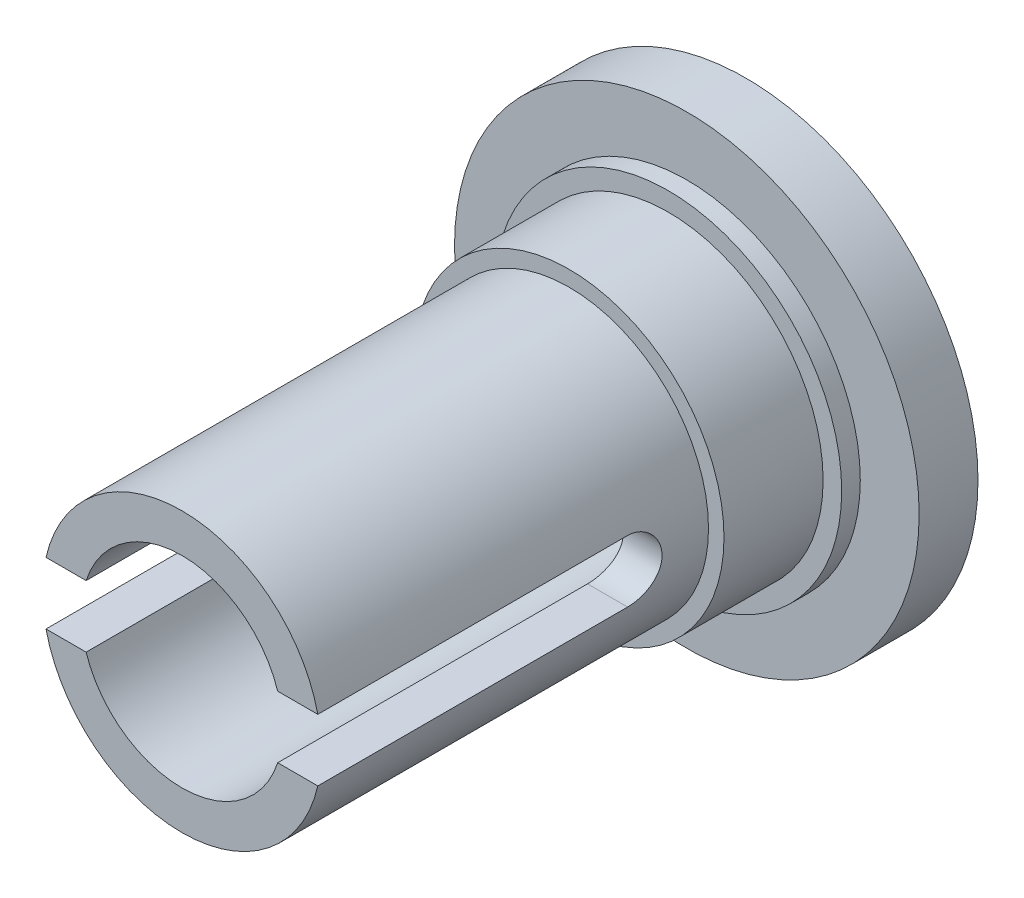
ISO-10303-21;
HEADER;
FILE_DESCRIPTION(('STEP AP214'),'2;1');
FILE_NAME('part.step','',(''),(''),'','','');
FILE_SCHEMA(('AUTOMOTIVE_DESIGN { 1 0 10303 214 1 1 1 1 }'));
ENDSEC;
DATA;
#1=APPLICATION_CONTEXT('core data for automotive mechanical design processes');
#2=APPLICATION_PROTOCOL_DEFINITION('international standard','automotive_design',2000,#1);
#3=PRODUCT_CONTEXT('',#1,'mechanical');
#4=PRODUCT('Part','Part','',(#3));
#5=PRODUCT_RELATED_PRODUCT_CATEGORY('part','',(#4));
#6=PRODUCT_DEFINITION_FORMATION('','',#4);
#7=PRODUCT_DEFINITION_CONTEXT('part definition',#1,'design');
#8=PRODUCT_DEFINITION('design','',#6,#7);
#9=PRODUCT_DEFINITION_SHAPE('','',#8);
#10=(LENGTH_UNIT() NAMED_UNIT(*) SI_UNIT(.MILLI.,.METRE.));
#11=(NAMED_UNIT(*) PLANE_ANGLE_UNIT() SI_UNIT($,.RADIAN.));
#12=(NAMED_UNIT(*) SI_UNIT($,.STERADIAN.) SOLID_ANGLE_UNIT());
#13=UNCERTAINTY_MEASURE_WITH_UNIT(LENGTH_MEASURE(1.E-05),#10,'distance_accuracy_value','');
#14=(GEOMETRIC_REPRESENTATION_CONTEXT(3) GLOBAL_UNCERTAINTY_ASSIGNED_CONTEXT((#13)) GLOBAL_UNIT_ASSIGNED_CONTEXT((#10,
#11,#12)) REPRESENTATION_CONTEXT('',''));
#15=CARTESIAN_POINT('',(0.,0.,0.));
#16=DIRECTION('',(0.,0.,1.));
#17=DIRECTION('',(1.,0.,0.));
#18=AXIS2_PLACEMENT_3D('',#15,#16,#17);
#19=CARTESIAN_POINT('',(0.,0.,3.175));
#20=DIRECTION('',(0.,0.,1.));
#21=DIRECTION('',(1.,0.,0.));
#22=AXIS2_PLACEMENT_3D('',#19,#20,#21);
#23=PLANE('',#22);
#24=CARTESIAN_POINT('',(0.,0.,3.175));
#25=DIRECTION('',(0.,0.,1.));
#26=DIRECTION('',(1.,0.,0.));
#27=AXIS2_PLACEMENT_3D('',#24,#25,#26);
#28=CIRCLE('',#27,6.35);
#29=CARTESIAN_POINT('',(6.35,0.,3.175));
#30=VERTEX_POINT('',#29);
#31=EDGE_CURVE('E142',#30,#30,#28,.T.);
#32=ORIENTED_EDGE('',*,*,#31,.F.);
#33=EDGE_LOOP('',(#32));
#34=FACE_BOUND('',#33,.T.);
#35=CARTESIAN_POINT('',(0.,0.,3.175));
#36=DIRECTION('',(0.,0.,1.));
#37=DIRECTION('',(1.,0.,0.));
#38=AXIS2_PLACEMENT_3D('',#35,#36,#37);
#39=CIRCLE('',#38,7.112);
#40=CARTESIAN_POINT('',(7.112,0.,3.175));
#41=VERTEX_POINT('',#40);
#42=EDGE_CURVE('E226',#41,#41,#39,.T.);
#43=ORIENTED_EDGE('',*,*,#42,.T.);
#44=EDGE_LOOP('',(#43));
#45=FACE_BOUND('',#44,.T.);
#46=ADVANCED_FACE('F35',(#34,#45),#23,.T.);
#47=CARTESIAN_POINT('',(0.,0.,3.175));
#48=DIRECTION('',(0.,0.,-1.));
#49=DIRECTION('',(-1.,0.,0.));
#50=AXIS2_PLACEMENT_3D('',#47,#48,#49);
#51=CYLINDRICAL_SURFACE('',#50,9.525);
#52=CARTESIAN_POINT('',(0.,0.,0.));
#53=DIRECTION('',(0.,0.,1.));
#54=DIRECTION('',(1.,0.,0.));
#55=AXIS2_PLACEMENT_3D('',#52,#53,#54);
#56=CIRCLE('',#55,9.525);
#57=CARTESIAN_POINT('',(9.525,0.,0.));
#58=VERTEX_POINT('',#57);
#59=EDGE_CURVE('E148',#58,#58,#56,.T.);
#60=ORIENTED_EDGE('',*,*,#59,.T.);
#61=EDGE_LOOP('',(#60));
#62=FACE_BOUND('',#61,.T.);
#63=CARTESIAN_POINT('',(0.,0.,2.413));
#64=DIRECTION('',(0.,0.,1.));
#65=DIRECTION('',(1.,0.,0.));
#66=AXIS2_PLACEMENT_3D('',#63,#64,#65);
#67=CIRCLE('',#66,9.525);
#68=CARTESIAN_POINT('',(9.525,0.,2.413));
#69=VERTEX_POINT('',#68);
#70=EDGE_CURVE('E220',#69,#69,#67,.T.);
#71=ORIENTED_EDGE('',*,*,#70,.F.);
#72=EDGE_LOOP('',(#71));
#73=FACE_BOUND('',#72,.T.);
#74=ADVANCED_FACE('F37',(#62,#73),#51,.T.);
#75=CARTESIAN_POINT('',(0.,0.,23.114));
#76=DIRECTION('',(0.,0.,1.));
#77=DIRECTION('',(1.,0.,0.));
#78=AXIS2_PLACEMENT_3D('',#75,#76,#77);
#79=PLANE('',#78);
#80=CARTESIAN_POINT('',(0.,0.,23.114));
#81=DIRECTION('',(0.,0.,1.));
#82=DIRECTION('',(1.,0.,0.));
#83=AXIS2_PLACEMENT_3D('',#80,#81,#82);
#84=CIRCLE('',#83,5.715);
#85=CARTESIAN_POINT('',(5.57210238599399,1.27,23.114));
#86=VERTEX_POINT('',#85);
#87=CARTESIAN_POINT('',(-5.572102385994,1.27,23.114));
#88=VERTEX_POINT('',#87);
#89=EDGE_CURVE('E139',#86,#88,#84,.T.);
#90=ORIENTED_EDGE('',*,*,#89,.T.);
#91=DIRECTION('',(1.,0.,0.));
#92=VECTOR('',#91,1.);
#93=CARTESIAN_POINT('',(-9.525,1.27,23.114));
#94=LINE('',#93,#92);
#95=CARTESIAN_POINT('',(-3.92725810840082,1.27,23.114));
#96=VERTEX_POINT('',#95);
#97=EDGE_CURVE('E232',#88,#96,#94,.T.);
#98=ORIENTED_EDGE('',*,*,#97,.T.);
#99=CARTESIAN_POINT('',(0.,0.,23.114));
#100=DIRECTION('',(0.,0.,1.));
#101=DIRECTION('',(1.,0.,0.));
#102=AXIS2_PLACEMENT_3D('',#99,#100,#101);
#103=CIRCLE('',#102,4.1275);
#104=CARTESIAN_POINT('',(3.92725810840082,1.27,23.114));
#105=VERTEX_POINT('',#104);
#106=EDGE_CURVE('E128',#105,#96,#103,.T.);
#107=ORIENTED_EDGE('',*,*,#106,.F.);
#108=EDGE_CURVE('E233',#105,#86,#94,.T.);
#109=ORIENTED_EDGE('',*,*,#108,.T.);
#110=EDGE_LOOP('',(#90,#98,#107,#109));
#111=FACE_BOUND('',#110,.T.);
#112=ADVANCED_FACE('F201',(#111),#79,.T.);
#113=CARTESIAN_POINT('',(0.,0.,7.239));
#114=DIRECTION('',(0.,0.,1.));
#115=DIRECTION('',(1.,0.,0.));
#116=AXIS2_PLACEMENT_3D('',#113,#114,#115);
#117=PLANE('',#116);
#118=CARTESIAN_POINT('',(0.,0.,7.239));
#119=DIRECTION('',(0.,0.,1.));
#120=DIRECTION('',(1.,0.,0.));
#121=AXIS2_PLACEMENT_3D('',#118,#119,#120);
#122=CIRCLE('',#121,6.35);
#123=CARTESIAN_POINT('',(6.35,0.,7.239));
#124=VERTEX_POINT('',#123);
#125=EDGE_CURVE('E145',#124,#124,#122,.T.);
#126=ORIENTED_EDGE('',*,*,#125,.T.);
#127=EDGE_LOOP('',(#126));
#128=FACE_BOUND('',#127,.T.);
#129=CARTESIAN_POINT('',(0.,0.,7.239));
#130=DIRECTION('',(0.,0.,1.));
#131=DIRECTION('',(1.,0.,0.));
#132=AXIS2_PLACEMENT_3D('',#129,#130,#131);
#133=CIRCLE('',#132,5.715);
#134=CARTESIAN_POINT('',(5.715,0.,7.239));
#135=VERTEX_POINT('',#134);
#136=EDGE_CURVE('E136',#135,#135,#133,.T.);
#137=ORIENTED_EDGE('',*,*,#136,.F.);
#138=EDGE_LOOP('',(#137));
#139=FACE_BOUND('',#138,.T.);
#140=ADVANCED_FACE('F196',(#128,#139),#117,.T.);
#141=CARTESIAN_POINT('',(0.,0.,0.));
#142=DIRECTION('',(0.,0.,1.));
#143=DIRECTION('',(1.,0.,0.));
#144=AXIS2_PLACEMENT_3D('',#141,#142,#143);
#145=PLANE('',#144);
#146=CARTESIAN_POINT('',(0.,0.,0.));
#147=DIRECTION('',(0.,0.,1.));
#148=DIRECTION('',(1.,0.,0.));
#149=AXIS2_PLACEMENT_3D('',#146,#147,#148);
#150=CIRCLE('',#149,4.1275);
#151=CARTESIAN_POINT('',(4.1275,0.,0.));
#152=VERTEX_POINT('',#151);
#153=EDGE_CURVE('E134',#152,#152,#150,.T.);
#154=ORIENTED_EDGE('',*,*,#153,.T.);
#155=EDGE_LOOP('',(#154));
#156=FACE_BOUND('',#155,.T.);
#157=ORIENTED_EDGE('',*,*,#59,.F.);
#158=EDGE_LOOP('',(#157));
#159=FACE_BOUND('',#158,.T.);
#160=ADVANCED_FACE('F200',(#156,#159),#145,.F.);
#161=CARTESIAN_POINT('',(0.,0.,7.239));
#162=DIRECTION('',(0.,0.,-1.));
#163=DIRECTION('',(-1.,0.,0.));
#164=AXIS2_PLACEMENT_3D('',#161,#162,#163);
#165=CYLINDRICAL_SURFACE('',#164,6.35);
#166=ORIENTED_EDGE('',*,*,#125,.F.);
#167=EDGE_LOOP('',(#166));
#168=FACE_BOUND('',#167,.T.);
#169=ORIENTED_EDGE('',*,*,#31,.T.);
#170=EDGE_LOOP('',(#169));
#171=FACE_BOUND('',#170,.T.);
#172=ADVANCED_FACE('F195',(#168,#171),#165,.T.);
#173=CARTESIAN_POINT('',(0.,0.,23.114));
#174=DIRECTION('',(0.,0.,-1.));
#175=DIRECTION('',(-1.,0.,0.));
#176=AXIS2_PLACEMENT_3D('',#173,#174,#175);
#177=CYLINDRICAL_SURFACE('',#176,5.715);
#178=CARTESIAN_POINT('',(-5.572102385994,-1.27,23.114));
#179=VERTEX_POINT('',#178);
#180=CARTESIAN_POINT('',(5.57210238599399,-1.27,23.114));
#181=VERTEX_POINT('',#180);
#182=EDGE_CURVE('E123',#179,#181,#84,.T.);
#183=ORIENTED_EDGE('',*,*,#182,.F.);
#184=DIRECTION('',(0.,0.,-1.));
#185=VECTOR('',#184,1.);
#186=CARTESIAN_POINT('',(-5.572102385994,-1.27,23.114));
#187=LINE('',#186,#185);
#188=CARTESIAN_POINT('',(-5.572102385994,-1.27,10.414));
#189=VERTEX_POINT('',#188);
#190=EDGE_CURVE('E111',#179,#189,#187,.T.);
#191=ORIENTED_EDGE('',*,*,#190,.T.);
#192=CARTESIAN_POINT('',(-5.572102385994,1.27,10.414));
#193=CARTESIAN_POINT('',(-5.57210033431422,1.2700002886679,10.3787415319893));
#194=CARTESIAN_POINT('',(-5.57243746816419,1.26853076839505,10.3435004046868));
#195=CARTESIAN_POINT('',(-5.57376879468674,1.26267170256151,10.2732792109694));
#196=CARTESIAN_POINT('',(-5.57476289398325,1.25828257197143,10.2382991081687));
#197=CARTESIAN_POINT('',(-5.57869201583469,1.24079483881178,10.1342551543151));
#198=CARTESIAN_POINT('',(-5.58257408104555,1.22337565599248,10.0659022934164));
#199=CARTESIAN_POINT('',(-5.59241570235688,1.17756235663275,9.93318476788078));
#200=CARTESIAN_POINT('',(-5.59837531183668,1.1491679580988,9.86882020576717));
#201=CARTESIAN_POINT('',(-5.61169730292401,1.08223787016907,9.74574333976131));
#202=CARTESIAN_POINT('',(-5.61905992659806,1.04370043032394,9.68703201387509));
#203=CARTESIAN_POINT('',(-5.63450011971702,0.956871132014771,9.57593935001058));
#204=CARTESIAN_POINT('',(-5.64258701587514,0.908437093721871,9.52367046555406));
#205=CARTESIAN_POINT('',(-5.65848378492406,0.803491279201034,9.42792306299641));
#206=CARTESIAN_POINT('',(-5.6662936142488,0.746978239594299,9.38444592230371));
#207=CARTESIAN_POINT('',(-5.68085810053731,0.62672051312932,9.30707278573947));
#208=CARTESIAN_POINT('',(-5.6876003787399,0.562903963054803,9.27328595589699));
#209=CARTESIAN_POINT('',(-5.69916350889388,0.430327214016063,9.21696045797091));
#210=CARTESIAN_POINT('',(-5.70398468395288,0.361567848675181,9.19441989823214));
#211=CARTESIAN_POINT('',(-5.71109651574733,0.22223224711941,9.16158115239811));
#212=CARTESIAN_POINT('',(-5.71342676592487,0.15170325852956,9.15109121327489));
#213=CARTESIAN_POINT('',(-5.71543148284502,0.00984899319221414,9.14205161714235));
#214=CARTESIAN_POINT('',(-5.71510620230141,-0.0614762071386213,9.14350082394348));
#215=CARTESIAN_POINT('',(-5.71186658196465,-0.201572089898147,9.15815654130692));
#216=CARTESIAN_POINT('',(-5.70899782716989,-0.270365636671191,9.17115605222394));
#217=CARTESIAN_POINT('',(-5.70104569021129,-0.404769114462065,9.20821309199694));
#218=CARTESIAN_POINT('',(-5.69596222357359,-0.470378923939228,9.23227104264745));
#219=CARTESIAN_POINT('',(-5.68407883487688,-0.597125548470132,9.29094382957392));
#220=CARTESIAN_POINT('',(-5.67726627933057,-0.658224972346418,9.32563677529204));
#221=CARTESIAN_POINT('',(-5.66267115372169,-0.773808203830123,9.40453554288825));
#222=CARTESIAN_POINT('',(-5.65488847518277,-0.828291270268476,9.44874242898987));
#223=CARTESIAN_POINT('',(-5.63901158115877,-0.930322644042804,9.54653300881645));
#224=CARTESIAN_POINT('',(-5.63091426205983,-0.977697979733709,9.60029681152121));
#225=CARTESIAN_POINT('',(-5.61547395751365,-1.06280490398276,9.71510675151449));
#226=CARTESIAN_POINT('',(-5.60813117891049,-1.10053385234824,9.77615487581284));
#227=CARTESIAN_POINT('',(-5.59502143182091,-1.1653592669891,9.90409582162349));
#228=CARTESIAN_POINT('',(-5.58926036936169,-1.19241604386841,9.97100935006377));
#229=CARTESIAN_POINT('',(-5.58004860361575,-1.23481221918731,10.108550270708));
#230=CARTESIAN_POINT('',(-5.57659446015608,-1.25016906987579,10.179171962733));
#231=CARTESIAN_POINT('',(-5.57370367626065,-1.26295698248683,10.2776488227881));
#232=CARTESIAN_POINT('',(-5.57310395825763,-1.26559885347446,10.3048719938928));
#233=CARTESIAN_POINT('',(-5.57230358456448,-1.26911823577543,10.3593925917928));
#234=CARTESIAN_POINT('',(-5.57210226764738,-1.26999867057412,10.3866898201267));
#235=CARTESIAN_POINT('',(-5.572102385994,-1.27,10.414));
#236=B_SPLINE_CURVE_WITH_KNOTS('',3,(#192,#193,#194,#195,#196,#197,#198,#199,#200,#201,#202,
#203,#204,#205,#206,#207,#208,#209,#210,#211,#212,#213,#214,#215,#216,#217,#218,#219,#220,#221,
#222,#223,#224,#225,#226,#227,#228,#229,#230,#231,#232,#233,#234,#235),.UNSPECIFIED.,.F.,.F.,(4,
2,2,2,2,2,2,2,2,2,2,2,2,2,2,2,2,2,2,2,2,4),(0.,0.10570899772398,0.21140297400639,
0.422242053977663,0.633086551537566,0.843967459762654,1.05812305775957,1.27231218170758,
1.48882713743168,1.705305662426,1.91828960504676,2.13125327927163,2.34047560663214,
2.54970591487975,2.76051132099894,2.97134031994902,3.18667233753988,3.40206322804035,
3.61824776230433,3.83410918910872,3.9161352623389,3.9980250821958),.UNSPECIFIED.);
#237=CARTESIAN_POINT('',(-5.572102385994,1.27,10.414));
#238=VERTEX_POINT('',#237);
#239=EDGE_CURVE('E99',#238,#189,#236,.T.);
#240=ORIENTED_EDGE('',*,*,#239,.F.);
#241=DIRECTION('',(0.,0.,-1.));
#242=VECTOR('',#241,1.);
#243=CARTESIAN_POINT('',(-5.572102385994,1.27,23.114));
#244=LINE('',#243,#242);
#245=EDGE_CURVE('E130',#88,#238,#244,.T.);
#246=ORIENTED_EDGE('',*,*,#245,.F.);
#247=ORIENTED_EDGE('',*,*,#89,.F.);
#248=DIRECTION('',(0.,0.,-1.));
#249=VECTOR('',#248,1.);
#250=CARTESIAN_POINT('',(5.572102385994,1.27,23.114));
#251=LINE('',#250,#249);
#252=CARTESIAN_POINT('',(5.572102385994,1.27,10.414));
#253=VERTEX_POINT('',#252);
#254=EDGE_CURVE('E106',#253,#86,#251,.F.);
#255=ORIENTED_EDGE('',*,*,#254,.F.);
#256=CARTESIAN_POINT('',(5.572102385994,-1.27,10.414));
#257=CARTESIAN_POINT('',(5.57210033431421,-1.2700002886679,10.3787415319893));
#258=CARTESIAN_POINT('',(5.57243746816419,-1.26853076839505,10.3435004046868));
#259=CARTESIAN_POINT('',(5.57376879468674,-1.26267170256151,10.2732792109694));
#260=CARTESIAN_POINT('',(5.57476289398325,-1.25828257197143,10.2382991081687));
#261=CARTESIAN_POINT('',(5.57869201583469,-1.24079483881178,10.1342551543151));
#262=CARTESIAN_POINT('',(5.58257408104555,-1.22337565599248,10.0659022934164));
#263=CARTESIAN_POINT('',(5.59241570235688,-1.17756235663275,9.93318476788078));
#264=CARTESIAN_POINT('',(5.59837531183668,-1.1491679580988,9.86882020576717));
#265=CARTESIAN_POINT('',(5.61169730292401,-1.08223787016907,9.74574333976131));
#266=CARTESIAN_POINT('',(5.61905992659806,-1.04370043032394,9.68703201387509));
#267=CARTESIAN_POINT('',(5.63450011971702,-0.956871132014771,9.57593935001058));
#268=CARTESIAN_POINT('',(5.64258701587514,-0.908437093721871,9.52367046555406));
#269=CARTESIAN_POINT('',(5.65848378492406,-0.803491279201034,9.42792306299641));
#270=CARTESIAN_POINT('',(5.6662936142488,-0.746978239594299,9.38444592230371));
#271=CARTESIAN_POINT('',(5.68085810053731,-0.62672051312932,9.30707278573947));
#272=CARTESIAN_POINT('',(5.6876003787399,-0.562903963054804,9.27328595589699));
#273=CARTESIAN_POINT('',(5.69916350889388,-0.430327214016064,9.21696045797091));
#274=CARTESIAN_POINT('',(5.70398468395288,-0.361567848675182,9.19441989823214));
#275=CARTESIAN_POINT('',(5.71109651574733,-0.22223224711941,9.16158115239811));
#276=CARTESIAN_POINT('',(5.71342676592487,-0.15170325852956,9.15109121327489));
#277=CARTESIAN_POINT('',(5.71543148284502,-0.00984899319221423,9.14205161714235));
#278=CARTESIAN_POINT('',(5.71510620230141,0.0614762071386213,9.14350082394348));
#279=CARTESIAN_POINT('',(5.71186658196465,0.201572089898147,9.15815654130692));
#280=CARTESIAN_POINT('',(5.70899782716989,0.270365636671191,9.17115605222394));
#281=CARTESIAN_POINT('',(5.70104569021129,0.404769114462065,9.20821309199694));
#282=CARTESIAN_POINT('',(5.69596222357359,0.470378923939229,9.23227104264745));
#283=CARTESIAN_POINT('',(5.68407883487688,0.597125548470133,9.29094382957392));
#284=CARTESIAN_POINT('',(5.67726627933057,0.658224972346419,9.32563677529204));
#285=CARTESIAN_POINT('',(5.66267115372169,0.773808203830124,9.40453554288825));
#286=CARTESIAN_POINT('',(5.65488847518277,0.828291270268477,9.44874242898987));
#287=CARTESIAN_POINT('',(5.63901158115877,0.930322644042805,9.54653300881645));
#288=CARTESIAN_POINT('',(5.63091426205983,0.97769797973371,9.60029681152121));
#289=CARTESIAN_POINT('',(5.61547395751365,1.06280490398276,9.71510675151449));
#290=CARTESIAN_POINT('',(5.60813117891049,1.10053385234824,9.77615487581284));
#291=CARTESIAN_POINT('',(5.59502143182091,1.1653592669891,9.90409582162349));
#292=CARTESIAN_POINT('',(5.58926036936169,1.19241604386841,9.97100935006377));
#293=CARTESIAN_POINT('',(5.58004860361575,1.23481221918731,10.108550270708));
#294=CARTESIAN_POINT('',(5.57659446015608,1.25016906987579,10.179171962733));
#295=CARTESIAN_POINT('',(5.57370367626065,1.26295698248683,10.2776488227881));
#296=CARTESIAN_POINT('',(5.57310395825763,1.26559885347446,10.3048719938928));
#297=CARTESIAN_POINT('',(5.57230358456448,1.26911823577543,10.3593925917928));
#298=CARTESIAN_POINT('',(5.57210226764738,1.26999867057412,10.3866898201267));
#299=CARTESIAN_POINT('',(5.572102385994,1.27,10.414));
#300=B_SPLINE_CURVE_WITH_KNOTS('',3,(#256,#257,#258,#259,#260,#261,#262,#263,#264,#265,#266,
#267,#268,#269,#270,#271,#272,#273,#274,#275,#276,#277,#278,#279,#280,#281,#282,#283,#284,#285,
#286,#287,#288,#289,#290,#291,#292,#293,#294,#295,#296,#297,#298,#299),.UNSPECIFIED.,.F.,.F.,(4,
2,2,2,2,2,2,2,2,2,2,2,2,2,2,2,2,2,2,2,2,4),(0.,0.10570899772398,0.21140297400639,
0.422242053977663,0.633086551537566,0.843967459762655,1.05812305775957,1.27231218170758,
1.48882713743168,1.705305662426,1.91828960504676,2.13125327927163,2.34047560663214,
2.54970591487975,2.76051132099894,2.97134031994902,3.18667233753988,3.40206322804035,
3.61824776230433,3.83410918910872,3.9161352623389,3.9980250821958),.UNSPECIFIED.);
#301=CARTESIAN_POINT('',(5.572102385994,-1.27,10.414));
#302=VERTEX_POINT('',#301);
#303=EDGE_CURVE('E107',#302,#253,#300,.T.);
#304=ORIENTED_EDGE('',*,*,#303,.F.);
#305=DIRECTION('',(0.,0.,-1.));
#306=VECTOR('',#305,1.);
#307=CARTESIAN_POINT('',(5.572102385994,-1.27,23.114));
#308=LINE('',#307,#306);
#309=EDGE_CURVE('E125',#302,#181,#308,.F.);
#310=ORIENTED_EDGE('',*,*,#309,.T.);
#311=EDGE_LOOP('',(#183,#191,#240,#246,#247,#255,#304,#310));
#312=FACE_BOUND('',#311,.T.);
#313=ORIENTED_EDGE('',*,*,#136,.T.);
#314=EDGE_LOOP('',(#313));
#315=FACE_BOUND('',#314,.T.);
#316=ADVANCED_FACE('F119',(#312,#315),#177,.T.);
#317=DIRECTION('',(1.,0.,0.));
#318=VECTOR('',#317,1.);
#319=CARTESIAN_POINT('',(-9.525,-1.27,23.114));
#320=LINE('',#319,#318);
#321=CARTESIAN_POINT('',(-3.92725810840082,-1.27,23.114));
#322=VERTEX_POINT('',#321);
#323=EDGE_CURVE('E185',#179,#322,#320,.T.);
#324=ORIENTED_EDGE('',*,*,#323,.F.);
#325=ORIENTED_EDGE('',*,*,#182,.T.);
#326=CARTESIAN_POINT('',(3.92725810840082,-1.27,23.114));
#327=VERTEX_POINT('',#326);
#328=EDGE_CURVE('E230',#327,#181,#320,.T.);
#329=ORIENTED_EDGE('',*,*,#328,.F.);
#330=EDGE_CURVE('E124',#322,#327,#103,.T.);
#331=ORIENTED_EDGE('',*,*,#330,.F.);
#332=EDGE_LOOP('',(#324,#325,#329,#331));
#333=FACE_BOUND('',#332,.T.);
#334=ADVANCED_FACE('F194',(#333),#79,.T.);
#335=CARTESIAN_POINT('',(0.,0.,0.));
#336=DIRECTION('',(0.,0.,1.));
#337=DIRECTION('',(1.,0.,0.));
#338=AXIS2_PLACEMENT_3D('',#335,#336,#337);
#339=CYLINDRICAL_SURFACE('',#338,4.1275);
#340=ORIENTED_EDGE('',*,*,#330,.T.);
#341=DIRECTION('',(0.,0.,1.));
#342=VECTOR('',#341,1.);
#343=CARTESIAN_POINT('',(3.92725810840082,-1.27,0.));
#344=LINE('',#343,#342);
#345=CARTESIAN_POINT('',(3.92725810840082,-1.27,10.414));
#346=VERTEX_POINT('',#345);
#347=EDGE_CURVE('E11',#327,#346,#344,.F.);
#348=ORIENTED_EDGE('',*,*,#347,.T.);
#349=CARTESIAN_POINT('',(3.92725810840082,1.27,10.414));
#350=CARTESIAN_POINT('',(3.92725502959949,1.27000077278987,10.379180346183));
#351=CARTESIAN_POINT('',(3.92772177001265,1.26856710318602,10.3443782824866));
#352=CARTESIAN_POINT('',(3.9295634495033,1.26285423332205,10.2750407576475));
#353=CARTESIAN_POINT('',(3.93093817544157,1.25857570085938,10.2405052358614));
#354=CARTESIAN_POINT('',(3.93636483211431,1.24154666434406,10.1378611251727));
#355=CARTESIAN_POINT('',(3.94171968035288,1.22460233502671,10.07046801356));
#356=CARTESIAN_POINT('',(3.95526298916981,1.18012004470699,9.93966263862785));
#357=CARTESIAN_POINT('',(3.96345033234456,1.15258626070839,9.87624881713733));
#358=CARTESIAN_POINT('',(3.98173034344297,1.08775501368531,9.75489238824133));
#359=CARTESIAN_POINT('',(3.99182396040179,1.05045268381532,9.69695252768588));
#360=CARTESIAN_POINT('',(4.01315229174583,0.965826457165954,9.58630713518208));
#361=CARTESIAN_POINT('',(4.0244121516858,0.918235530717746,9.5338107283383));
#362=CARTESIAN_POINT('',(4.04659069881898,0.814951703208876,9.43740118131794));
#363=CARTESIAN_POINT('',(4.05750932746656,0.759257421012217,9.39348950731943));
#364=CARTESIAN_POINT('',(4.07806334826584,0.639843609905481,9.31457685796062));
#365=CARTESIAN_POINT('',(4.08766546802188,0.575975252753233,9.27979167422986));
#366=CARTESIAN_POINT('',(4.10420931683811,0.442951886573728,9.22153957270181));
#367=CARTESIAN_POINT('',(4.11115175971268,0.373798302001117,9.19806961764194));
#368=CARTESIAN_POINT('',(4.12141564644699,0.234365737468668,9.16381171563971));
#369=CARTESIAN_POINT('',(4.12483941674418,0.164182666538752,9.15266462608895));
#370=CARTESIAN_POINT('',(4.12804122620973,0.0228630361448351,9.14223176251706));
#371=CARTESIAN_POINT('',(4.12781999501391,-0.048273329645379,9.14294361464021));
#372=CARTESIAN_POINT('',(4.12382825251388,-0.186952998746059,9.15597077186036));
#373=CARTESIAN_POINT('',(4.12017684594302,-0.254536851474559,9.16789670763969));
#374=CARTESIAN_POINT('',(4.1098809097671,-0.386691920812751,9.20237554874785));
#375=CARTESIAN_POINT('',(4.10323622072914,-0.451262976747937,9.22492902014009));
#376=CARTESIAN_POINT('',(4.08753852119621,-0.576469862247002,9.28027828371647));
#377=CARTESIAN_POINT('',(4.07845750707018,-0.63704902297912,9.31319399750764));
#378=CARTESIAN_POINT('',(4.05884661590427,-0.751945798414551,9.38823754903216));
#379=CARTESIAN_POINT('',(4.04831639807751,-0.806261934801339,9.43036755492548));
#380=CARTESIAN_POINT('',(4.02642831959444,-0.909409169551664,9.52464545366274));
#381=CARTESIAN_POINT('',(4.01505420848547,-0.957930314246805,9.57712910889819));
#382=CARTESIAN_POINT('',(3.99312672629714,-1.04558238169715,9.68960958145719));
#383=CARTESIAN_POINT('',(3.98257359990585,-1.08471051213035,9.74960862488203));
#384=CARTESIAN_POINT('',(3.96339990247371,-1.15281722055914,9.87628060417436));
#385=CARTESIAN_POINT('',(3.9548019935879,-1.18167877246847,9.94302000707255));
#386=CARTESIAN_POINT('',(3.94078445706244,-1.22762394187168,10.0807036227046));
#387=CARTESIAN_POINT('',(3.93535994079038,-1.24472568260166,10.1516411815022));
#388=CARTESIAN_POINT('',(3.93034637136847,-1.26041794371088,10.2550407568471));
#389=CARTESIAN_POINT('',(3.92919098397744,-1.26401057235856,10.2867374898314));
#390=CARTESIAN_POINT('',(3.92764666023017,-1.26879957412294,10.3502840585549));
#391=CARTESIAN_POINT('',(3.92725662343968,-1.26999938771097,10.3821336083749));
#392=CARTESIAN_POINT('',(3.92725810840082,-1.27,10.414));
#393=B_SPLINE_CURVE_WITH_KNOTS('',3,(#349,#350,#351,#352,#353,#354,#355,#356,#357,#358,#359,
#360,#361,#362,#363,#364,#365,#366,#367,#368,#369,#370,#371,#372,#373,#374,#375,#376,#377,#378,
#379,#380,#381,#382,#383,#384,#385,#386,#387,#388,#389,#390,#391,#392),.UNSPECIFIED.,.F.,.F.,(4,
2,2,2,2,2,2,2,2,2,2,2,2,2,2,2,2,2,2,2,2,4),(0.,0.104391911232003,0.208759326361613,
0.416763036905177,0.624684784524689,0.832710319812343,1.04697541203302,1.2612770664703,
1.48026375362392,1.69919162703993,1.91155544455289,2.12387675279153,2.32908794381747,
2.53431006641624,2.74200038587466,2.94973962837914,3.165865339286,3.38205521993527,
3.60063588083522,3.81887892398762,3.91455758547491,4.01009857744076),.UNSPECIFIED.);
#394=CARTESIAN_POINT('',(3.92725810840082,1.27,10.414));
#395=VERTEX_POINT('',#394);
#396=EDGE_CURVE('E176',#395,#346,#393,.T.);
#397=ORIENTED_EDGE('',*,*,#396,.F.);
#398=DIRECTION('',(0.,0.,1.));
#399=VECTOR('',#398,1.);
#400=CARTESIAN_POINT('',(3.92725810840082,1.27,0.));
#401=LINE('',#400,#399);
#402=EDGE_CURVE('E43',#105,#395,#401,.F.);
#403=ORIENTED_EDGE('',*,*,#402,.F.);
#404=ORIENTED_EDGE('',*,*,#106,.T.);
#405=DIRECTION('',(0.,0.,1.));
#406=VECTOR('',#405,1.);
#407=CARTESIAN_POINT('',(-3.92725810840082,1.27,0.));
#408=LINE('',#407,#406);
#409=CARTESIAN_POINT('',(-3.92725810840082,1.27,10.414));
#410=VERTEX_POINT('',#409);
#411=EDGE_CURVE('E160',#410,#96,#408,.T.);
#412=ORIENTED_EDGE('',*,*,#411,.F.);
#413=CARTESIAN_POINT('',(-3.92725810840082,-1.27,10.414));
#414=CARTESIAN_POINT('',(-3.92725502959949,-1.27000077278987,10.379180346183));
#415=CARTESIAN_POINT('',(-3.92772177001265,-1.26856710318602,10.3443782824866));
#416=CARTESIAN_POINT('',(-3.9295634495033,-1.26285423332205,10.2750407576475));
#417=CARTESIAN_POINT('',(-3.93093817544157,-1.25857570085938,10.2405052358614));
#418=CARTESIAN_POINT('',(-3.93636483211431,-1.24154666434406,10.1378611251727));
#419=CARTESIAN_POINT('',(-3.94171968035288,-1.22460233502671,10.07046801356));
#420=CARTESIAN_POINT('',(-3.95526298916981,-1.18012004470699,9.93966263862785));
#421=CARTESIAN_POINT('',(-3.96345033234456,-1.15258626070839,9.87624881713733));
#422=CARTESIAN_POINT('',(-3.98173034344297,-1.08775501368531,9.75489238824133));
#423=CARTESIAN_POINT('',(-3.99182396040179,-1.05045268381532,9.69695252768588));
#424=CARTESIAN_POINT('',(-4.01315229174583,-0.965826457165954,9.58630713518208));
#425=CARTESIAN_POINT('',(-4.0244121516858,-0.918235530717746,9.5338107283383));
#426=CARTESIAN_POINT('',(-4.04659069881898,-0.814951703208876,9.43740118131794));
#427=CARTESIAN_POINT('',(-4.05750932746656,-0.759257421012217,9.39348950731943));
#428=CARTESIAN_POINT('',(-4.07806334826584,-0.639843609905481,9.31457685796062));
#429=CARTESIAN_POINT('',(-4.08766546802188,-0.575975252753233,9.27979167422986));
#430=CARTESIAN_POINT('',(-4.10420931683811,-0.442951886573728,9.22153957270181));
#431=CARTESIAN_POINT('',(-4.11115175971268,-0.373798302001117,9.19806961764194));
#432=CARTESIAN_POINT('',(-4.12141564644699,-0.234365737468668,9.16381171563971));
#433=CARTESIAN_POINT('',(-4.12483941674418,-0.164182666538752,9.15266462608895));
#434=CARTESIAN_POINT('',(-4.12804122620973,-0.022863036144835,9.14223176251706));
#435=CARTESIAN_POINT('',(-4.12781999501391,0.0482733296453791,9.14294361464021));
#436=CARTESIAN_POINT('',(-4.12382825251388,0.186952998746059,9.15597077186036));
#437=CARTESIAN_POINT('',(-4.12017684594302,0.254536851474559,9.16789670763969));
#438=CARTESIAN_POINT('',(-4.1098809097671,0.386691920812751,9.20237554874785));
#439=CARTESIAN_POINT('',(-4.10323622072914,0.451262976747936,9.22492902014009));
#440=CARTESIAN_POINT('',(-4.08753852119621,0.576469862247002,9.28027828371647));
#441=CARTESIAN_POINT('',(-4.07845750707018,0.63704902297912,9.31319399750764));
#442=CARTESIAN_POINT('',(-4.05884661590427,0.75194579841455,9.38823754903216));
#443=CARTESIAN_POINT('',(-4.04831639807751,0.806261934801338,9.43036755492548));
#444=CARTESIAN_POINT('',(-4.02642831959444,0.909409169551663,9.52464545366274));
#445=CARTESIAN_POINT('',(-4.01505420848547,0.957930314246804,9.57712910889819));
#446=CARTESIAN_POINT('',(-3.99312672629714,1.04558238169715,9.68960958145719));
#447=CARTESIAN_POINT('',(-3.98257359990585,1.08471051213035,9.74960862488203));
#448=CARTESIAN_POINT('',(-3.96339990247371,1.15281722055913,9.87628060417436));
#449=CARTESIAN_POINT('',(-3.9548019935879,1.18167877246847,9.94302000707255));
#450=CARTESIAN_POINT('',(-3.94078445706244,1.22762394187168,10.0807036227046));
#451=CARTESIAN_POINT('',(-3.93535994079038,1.24472568260166,10.1516411815022));
#452=CARTESIAN_POINT('',(-3.93034637136847,1.26041794371088,10.2550407568471));
#453=CARTESIAN_POINT('',(-3.92919098397744,1.26401057235856,10.2867374898314));
#454=CARTESIAN_POINT('',(-3.92764666023017,1.26879957412294,10.3502840585549));
#455=CARTESIAN_POINT('',(-3.92725662343968,1.26999938771097,10.3821336083749));
#456=CARTESIAN_POINT('',(-3.92725810840082,1.27,10.414));
#457=B_SPLINE_CURVE_WITH_KNOTS('',3,(#413,#414,#415,#416,#417,#418,#419,#420,#421,#422,#423,
#424,#425,#426,#427,#428,#429,#430,#431,#432,#433,#434,#435,#436,#437,#438,#439,#440,#441,#442,
#443,#444,#445,#446,#447,#448,#449,#450,#451,#452,#453,#454,#455,#456),.UNSPECIFIED.,.F.,.F.,(4,
2,2,2,2,2,2,2,2,2,2,2,2,2,2,2,2,2,2,2,2,4),(0.,0.104391911232003,0.208759326361613,
0.416763036905177,0.624684784524689,0.832710319812342,1.04697541203302,1.2612770664703,
1.48026375362392,1.69919162703993,1.91155544455289,2.12387675279153,2.32908794381747,
2.53431006641624,2.74200038587466,2.94973962837914,3.165865339286,3.38205521993527,
3.60063588083522,3.81887892398762,3.91455758547491,4.01009857744076),.UNSPECIFIED.);
#458=CARTESIAN_POINT('',(-3.92725810840082,-1.27,10.414));
#459=VERTEX_POINT('',#458);
#460=EDGE_CURVE('E153',#459,#410,#457,.T.);
#461=ORIENTED_EDGE('',*,*,#460,.F.);
#462=DIRECTION('',(0.,0.,1.));
#463=VECTOR('',#462,1.);
#464=CARTESIAN_POINT('',(-3.92725810840082,-1.27,0.));
#465=LINE('',#464,#463);
#466=EDGE_CURVE('E114',#459,#322,#465,.T.);
#467=ORIENTED_EDGE('',*,*,#466,.T.);
#468=EDGE_LOOP('',(#340,#348,#397,#403,#404,#412,#461,#467));
#469=FACE_BOUND('',#468,.T.);
#470=ORIENTED_EDGE('',*,*,#153,.F.);
#471=EDGE_LOOP('',(#470));
#472=FACE_BOUND('',#471,.T.);
#473=ADVANCED_FACE('F162',(#469,#472),#339,.F.);
#474=CARTESIAN_POINT('',(-9.525,0.,10.414));
#475=DIRECTION('',(1.,0.,0.));
#476=DIRECTION('',(0.,0.,-1.));
#477=AXIS2_PLACEMENT_3D('',#474,#475,#476);
#478=CYLINDRICAL_SURFACE('',#477,1.27);
#479=ORIENTED_EDGE('',*,*,#239,.T.);
#480=DIRECTION('',(1.,0.,0.));
#481=VECTOR('',#480,1.);
#482=CARTESIAN_POINT('',(-9.525,-1.27,10.414));
#483=LINE('',#482,#481);
#484=EDGE_CURVE('E58',#189,#459,#483,.T.);
#485=ORIENTED_EDGE('',*,*,#484,.T.);
#486=ORIENTED_EDGE('',*,*,#460,.T.);
#487=DIRECTION('',(1.,0.,0.));
#488=VECTOR('',#487,1.);
#489=CARTESIAN_POINT('',(-9.525,1.27,10.414));
#490=LINE('',#489,#488);
#491=EDGE_CURVE('E102',#238,#410,#490,.T.);
#492=ORIENTED_EDGE('',*,*,#491,.F.);
#493=EDGE_LOOP('',(#479,#485,#486,#492));
#494=FACE_BOUND('',#493,.T.);
#495=ADVANCED_FACE('F100',(#494),#478,.F.);
#496=CARTESIAN_POINT('',(-9.525,1.27,4.94332391562462));
#497=DIRECTION('',(0.,-1.,0.));
#498=DIRECTION('',(0.,0.,-1.));
#499=AXIS2_PLACEMENT_3D('',#496,#497,#498);
#500=PLANE('',#499);
#501=ORIENTED_EDGE('',*,*,#245,.T.);
#502=ORIENTED_EDGE('',*,*,#491,.T.);
#503=ORIENTED_EDGE('',*,*,#411,.T.);
#504=ORIENTED_EDGE('',*,*,#97,.F.);
#505=EDGE_LOOP('',(#501,#502,#503,#504));
#506=FACE_BOUND('',#505,.T.);
#507=ADVANCED_FACE('F169',(#506),#500,.T.);
#508=CARTESIAN_POINT('',(-9.525,-1.27,4.94332391562462));
#509=DIRECTION('',(0.,-1.,0.));
#510=DIRECTION('',(0.,0.,-1.));
#511=AXIS2_PLACEMENT_3D('',#508,#509,#510);
#512=PLANE('',#511);
#513=ORIENTED_EDGE('',*,*,#323,.T.);
#514=ORIENTED_EDGE('',*,*,#466,.F.);
#515=ORIENTED_EDGE('',*,*,#484,.F.);
#516=ORIENTED_EDGE('',*,*,#190,.F.);
#517=EDGE_LOOP('',(#513,#514,#515,#516));
#518=FACE_BOUND('',#517,.T.);
#519=ADVANCED_FACE('F110',(#518),#512,.F.);
#520=EDGE_CURVE('E116',#346,#302,#483,.T.);
#521=ORIENTED_EDGE('',*,*,#520,.F.);
#522=ORIENTED_EDGE('',*,*,#347,.F.);
#523=ORIENTED_EDGE('',*,*,#328,.T.);
#524=ORIENTED_EDGE('',*,*,#309,.F.);
#525=EDGE_LOOP('',(#521,#522,#523,#524));
#526=FACE_BOUND('',#525,.T.);
#527=ADVANCED_FACE('F250',(#526),#512,.F.);
#528=ORIENTED_EDGE('',*,*,#254,.T.);
#529=ORIENTED_EDGE('',*,*,#108,.F.);
#530=ORIENTED_EDGE('',*,*,#402,.T.);
#531=EDGE_CURVE('E50',#395,#253,#490,.T.);
#532=ORIENTED_EDGE('',*,*,#531,.T.);
#533=EDGE_LOOP('',(#528,#529,#530,#532));
#534=FACE_BOUND('',#533,.T.);
#535=ADVANCED_FACE('F247',(#534),#500,.T.);
#536=ORIENTED_EDGE('',*,*,#303,.T.);
#537=ORIENTED_EDGE('',*,*,#531,.F.);
#538=ORIENTED_EDGE('',*,*,#396,.T.);
#539=ORIENTED_EDGE('',*,*,#520,.T.);
#540=EDGE_LOOP('',(#536,#537,#538,#539));
#541=FACE_BOUND('',#540,.T.);
#542=ADVANCED_FACE('F170',(#541),#478,.F.);
#543=CARTESIAN_POINT('',(0.,0.,2.413));
#544=DIRECTION('',(0.,0.,1.));
#545=DIRECTION('',(1.,0.,0.));
#546=AXIS2_PLACEMENT_3D('',#543,#544,#545);
#547=PLANE('',#546);
#548=CARTESIAN_POINT('',(0.,0.,2.413));
#549=DIRECTION('',(0.,0.,1.));
#550=DIRECTION('',(1.,0.,0.));
#551=AXIS2_PLACEMENT_3D('',#548,#549,#550);
#552=CIRCLE('',#551,7.112);
#553=CARTESIAN_POINT('',(7.112,0.,2.413));
#554=VERTEX_POINT('',#553);
#555=EDGE_CURVE('E222',#554,#554,#552,.T.);
#556=ORIENTED_EDGE('',*,*,#555,.F.);
#557=EDGE_LOOP('',(#556));
#558=FACE_BOUND('',#557,.T.);
#559=ORIENTED_EDGE('',*,*,#70,.T.);
#560=EDGE_LOOP('',(#559));
#561=FACE_BOUND('',#560,.T.);
#562=ADVANCED_FACE('F263',(#558,#561),#547,.T.);
#563=CARTESIAN_POINT('',(0.,0.,2.413));
#564=DIRECTION('',(0.,0.,1.));
#565=DIRECTION('',(1.,0.,0.));
#566=AXIS2_PLACEMENT_3D('',#563,#564,#565);
#567=CYLINDRICAL_SURFACE('',#566,7.112);
#568=CARTESIAN_POINT('',(7.112,0.,2.413));
#569=CARTESIAN_POINT('',(7.112,0.,2.4209375));
#570=CARTESIAN_POINT('',(7.112,0.,2.428875));
#571=CARTESIAN_POINT('',(7.112,0.,2.44475));
#572=CARTESIAN_POINT('',(7.112,0.,2.4526875));
#573=CARTESIAN_POINT('',(7.112,0.,2.4685625));
#574=CARTESIAN_POINT('',(7.112,0.,2.4765));
#575=CARTESIAN_POINT('',(7.112,0.,2.492375));
#576=CARTESIAN_POINT('',(7.112,0.,2.5003125));
#577=CARTESIAN_POINT('',(7.112,0.,2.5161875));
#578=CARTESIAN_POINT('',(7.112,0.,2.524125));
#579=CARTESIAN_POINT('',(7.112,0.,2.54));
#580=CARTESIAN_POINT('',(7.112,0.,2.5479375));
#581=CARTESIAN_POINT('',(7.112,0.,2.5638125));
#582=CARTESIAN_POINT('',(7.112,0.,2.57175));
#583=CARTESIAN_POINT('',(7.112,0.,2.587625));
#584=CARTESIAN_POINT('',(7.112,0.,2.5955625));
#585=CARTESIAN_POINT('',(7.112,0.,2.6114375));
#586=CARTESIAN_POINT('',(7.112,0.,2.619375));
#587=CARTESIAN_POINT('',(7.112,0.,2.63525));
#588=CARTESIAN_POINT('',(7.112,0.,2.6431875));
#589=CARTESIAN_POINT('',(7.112,0.,2.6590625));
#590=CARTESIAN_POINT('',(7.112,0.,2.667));
#591=CARTESIAN_POINT('',(7.112,0.,2.682875));
#592=CARTESIAN_POINT('',(7.112,0.,2.6908125));
#593=CARTESIAN_POINT('',(7.112,0.,2.7066875));
#594=CARTESIAN_POINT('',(7.112,0.,2.714625));
#595=CARTESIAN_POINT('',(7.112,0.,2.7305));
#596=CARTESIAN_POINT('',(7.112,0.,2.7384375));
#597=CARTESIAN_POINT('',(7.112,0.,2.7543125));
#598=CARTESIAN_POINT('',(7.112,0.,2.76225));
#599=CARTESIAN_POINT('',(7.112,0.,2.778125));
#600=CARTESIAN_POINT('',(7.112,0.,2.7860625));
#601=CARTESIAN_POINT('',(7.112,0.,2.8019375));
#602=CARTESIAN_POINT('',(7.112,0.,2.809875));
#603=CARTESIAN_POINT('',(7.112,0.,2.82575));
#604=CARTESIAN_POINT('',(7.112,0.,2.8336875));
#605=CARTESIAN_POINT('',(7.112,0.,2.8495625));
#606=CARTESIAN_POINT('',(7.112,0.,2.8575));
#607=CARTESIAN_POINT('',(7.112,0.,2.873375));
#608=CARTESIAN_POINT('',(7.112,0.,2.8813125));
#609=CARTESIAN_POINT('',(7.112,0.,2.8971875));
#610=CARTESIAN_POINT('',(7.112,0.,2.905125));
#611=CARTESIAN_POINT('',(7.112,0.,2.921));
#612=CARTESIAN_POINT('',(7.112,0.,2.9289375));
#613=CARTESIAN_POINT('',(7.112,0.,2.9448125));
#614=CARTESIAN_POINT('',(7.112,0.,2.95275));
#615=CARTESIAN_POINT('',(7.112,0.,2.968625));
#616=CARTESIAN_POINT('',(7.112,0.,2.9765625));
#617=CARTESIAN_POINT('',(7.112,0.,2.9924375));
#618=CARTESIAN_POINT('',(7.112,0.,3.000375));
#619=CARTESIAN_POINT('',(7.112,0.,3.01625));
#620=CARTESIAN_POINT('',(7.112,0.,3.0241875));
#621=CARTESIAN_POINT('',(7.112,0.,3.0400625));
#622=CARTESIAN_POINT('',(7.112,0.,3.048));
#623=CARTESIAN_POINT('',(7.112,0.,3.063875));
#624=CARTESIAN_POINT('',(7.112,0.,3.0718125));
#625=CARTESIAN_POINT('',(7.112,0.,3.0876875));
#626=CARTESIAN_POINT('',(7.112,0.,3.095625));
#627=CARTESIAN_POINT('',(7.112,0.,3.1115));
#628=CARTESIAN_POINT('',(7.112,0.,3.1194375));
#629=CARTESIAN_POINT('',(7.112,0.,3.1353125));
#630=CARTESIAN_POINT('',(7.112,0.,3.14325));
#631=CARTESIAN_POINT('',(7.112,0.,3.159125));
#632=CARTESIAN_POINT('',(7.112,0.,3.1670625));
#633=CARTESIAN_POINT('',(7.112,0.,3.175));
#634=B_SPLINE_CURVE_WITH_KNOTS('',3,(#568,#569,#570,#571,#572,#573,#574,#575,#576,#577,#578,
#579,#580,#581,#582,#583,#584,#585,#586,#587,#588,#589,#590,#591,#592,#593,#594,#595,#596,#597,
#598,#599,#600,#601,#602,#603,#604,#605,#606,#607,#608,#609,#610,#611,#612,#613,#614,#615,#616,
#617,#618,#619,#620,#621,#622,#623,#624,#625,#626,#627,#628,#629,#630,#631,#632,#633),
.UNSPECIFIED.,.F.,.F.,(4,2,2,2,2,2,2,2,2,2,2,2,2,2,2,2,2,2,2,2,2,2,2,2,2,2,2,2,2,2,2,2,4),(0.,
0.0238125000000004,0.0476250000000004,0.0714375000000003,0.0952500000000003,0.1190625,0.142875,
0.1666875,0.1905,0.2143125,0.238125,0.2619375,0.28575,0.3095625,0.333375,0.3571875,0.381,
0.4048125,0.428625,0.4524375,0.47625,0.5000625,0.523875,0.5476875,0.5715,0.5953125,0.619125,
0.6429375,0.66675,0.6905625,0.714375,0.7381875,0.762),.UNSPECIFIED.);
#635=EDGE_CURVE('BSEAM268',#554,#41,#634,.T.);
#636=ORIENTED_EDGE('',*,*,#555,.T.);
#637=ORIENTED_EDGE('',*,*,#42,.F.);
#638=ORIENTED_EDGE('',*,*,#635,.T.);
#639=ORIENTED_EDGE('',*,*,#635,.F.);
#640=EDGE_LOOP('',(#636,#638,#637,#639));
#641=FACE_BOUND('',#640,.T.);
#642=ADVANCED_FACE('F268',(#641),#567,.T.);
#643=CLOSED_SHELL('',(#46,#74,#112,#140,#160,#172,#316,#334,#473,#495,#507,#519,#527,#535,#542,
#562,#642));
#644=MANIFOLD_SOLID_BREP('B2',#643);
#645=ADVANCED_BREP_SHAPE_REPRESENTATION('',(#18,#644),#14);
#646=SHAPE_DEFINITION_REPRESENTATION(#9,#645);
ENDSEC;
END-ISO-10303-21;
